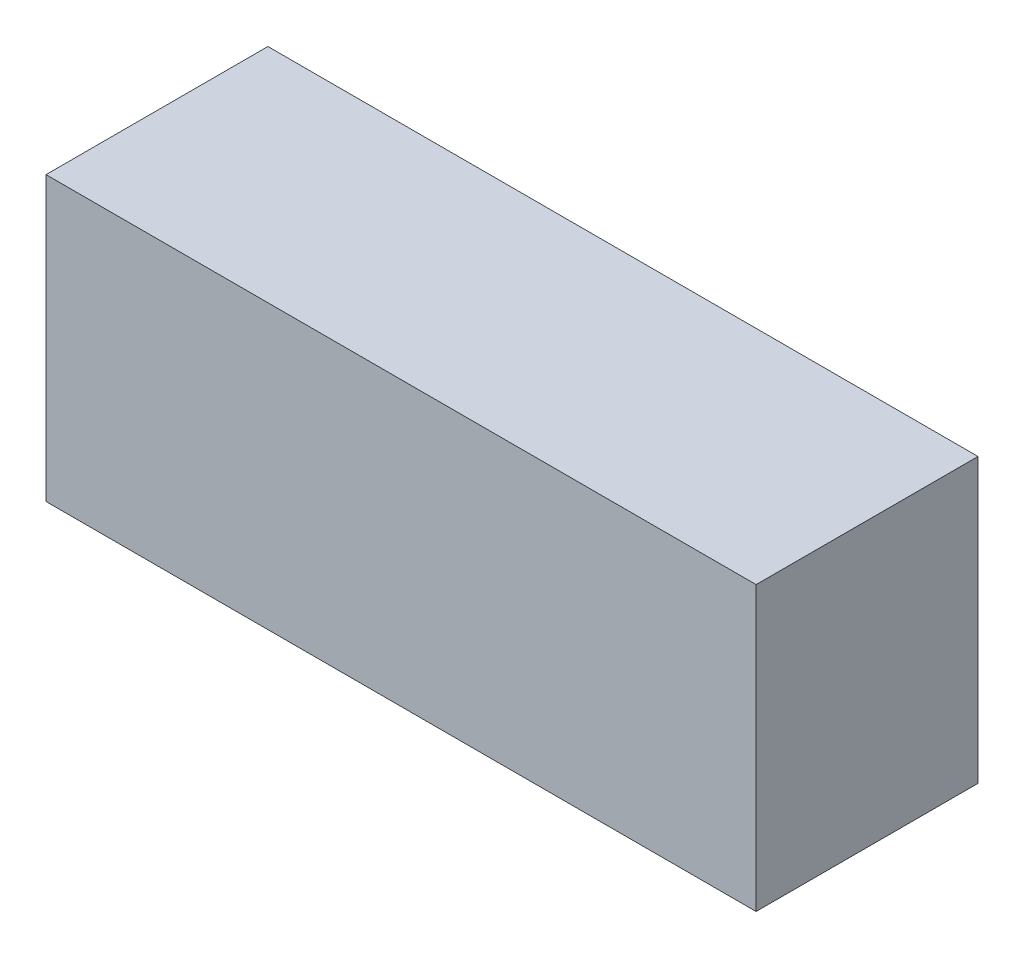
ISO-10303-21;
HEADER;
FILE_DESCRIPTION(('STEP AP214'),'2;1');
FILE_NAME('part.step','',(''),(''),'','','');
FILE_SCHEMA(('AUTOMOTIVE_DESIGN { 1 0 10303 214 1 1 1 1 }'));
ENDSEC;
DATA;
#1=APPLICATION_CONTEXT('core data for automotive mechanical design processes');
#2=APPLICATION_PROTOCOL_DEFINITION('international standard','automotive_design',2000,#1);
#3=PRODUCT_CONTEXT('',#1,'mechanical');
#4=PRODUCT('Part','Part','',(#3));
#5=PRODUCT_RELATED_PRODUCT_CATEGORY('part','',(#4));
#6=PRODUCT_DEFINITION_FORMATION('','',#4);
#7=PRODUCT_DEFINITION_CONTEXT('part definition',#1,'design');
#8=PRODUCT_DEFINITION('design','',#6,#7);
#9=PRODUCT_DEFINITION_SHAPE('','',#8);
#10=(LENGTH_UNIT() NAMED_UNIT(*) SI_UNIT(.MILLI.,.METRE.));
#11=(NAMED_UNIT(*) PLANE_ANGLE_UNIT() SI_UNIT($,.RADIAN.));
#12=(NAMED_UNIT(*) SI_UNIT($,.STERADIAN.) SOLID_ANGLE_UNIT());
#13=UNCERTAINTY_MEASURE_WITH_UNIT(LENGTH_MEASURE(1.E-05),#10,'distance_accuracy_value','');
#14=(GEOMETRIC_REPRESENTATION_CONTEXT(3) GLOBAL_UNCERTAINTY_ASSIGNED_CONTEXT((#13)) GLOBAL_UNIT_ASSIGNED_CONTEXT((#10,
#11,#12)) REPRESENTATION_CONTEXT('',''));
#15=CARTESIAN_POINT('',(0.,0.,0.));
#16=DIRECTION('',(0.,0.,1.));
#17=DIRECTION('',(1.,0.,0.));
#18=AXIS2_PLACEMENT_3D('',#15,#16,#17);
#19=CARTESIAN_POINT('',(9.398,3.175,1.6));
#20=DIRECTION('',(0.,0.,-1.));
#21=DIRECTION('',(0.,-1.,0.));
#22=AXIS2_PLACEMENT_3D('',#19,#20,#21);
#23=PLANE('',#22);
#24=DIRECTION('',(0.,-1.,0.));
#25=VECTOR('',#24,1.);
#26=CARTESIAN_POINT('',(7.798,2.55,1.6));
#27=LINE('',#26,#25);
#28=CARTESIAN_POINT('',(7.798,3.8258,1.6));
#29=VERTEX_POINT('',#28);
#30=CARTESIAN_POINT('',(7.798,2.55,1.6));
#31=VERTEX_POINT('',#30);
#32=EDGE_CURVE('E101',#29,#31,#27,.T.);
#33=ORIENTED_EDGE('',*,*,#32,.F.);
#34=DIRECTION('',(-1.,0.,0.));
#35=VECTOR('',#34,1.);
#36=CARTESIAN_POINT('',(7.798,3.8258,1.6));
#37=LINE('',#36,#35);
#38=CARTESIAN_POINT('',(10.998,3.8258,1.6));
#39=VERTEX_POINT('',#38);
#40=EDGE_CURVE('E26',#39,#29,#37,.T.);
#41=ORIENTED_EDGE('',*,*,#40,.F.);
#42=DIRECTION('',(0.,1.,0.));
#43=VECTOR('',#42,1.);
#44=CARTESIAN_POINT('',(10.998,3.8258,1.6));
#45=LINE('',#44,#43);
#46=CARTESIAN_POINT('',(10.998,2.55,1.6));
#47=VERTEX_POINT('',#46);
#48=EDGE_CURVE('E84',#47,#39,#45,.T.);
#49=ORIENTED_EDGE('',*,*,#48,.F.);
#50=DIRECTION('',(1.,0.,0.));
#51=VECTOR('',#50,1.);
#52=CARTESIAN_POINT('',(10.998,2.55,1.6));
#53=LINE('',#52,#51);
#54=EDGE_CURVE('E87',#31,#47,#53,.T.);
#55=ORIENTED_EDGE('',*,*,#54,.F.);
#56=EDGE_LOOP('',(#33,#41,#49,#55));
#57=FACE_BOUND('',#56,.T.);
#58=ADVANCED_FACE('F16',(#57),#23,.T.);
#59=CARTESIAN_POINT('',(9.398,3.175,2.6));
#60=DIRECTION('',(0.,0.,-1.));
#61=DIRECTION('',(0.,-1.,0.));
#62=AXIS2_PLACEMENT_3D('',#59,#60,#61);
#63=PLANE('',#62);
#64=DIRECTION('',(0.,-1.,0.));
#65=VECTOR('',#64,1.);
#66=CARTESIAN_POINT('',(7.798,2.55,2.6));
#67=LINE('',#66,#65);
#68=CARTESIAN_POINT('',(7.798,3.8258,2.6));
#69=VERTEX_POINT('',#68);
#70=CARTESIAN_POINT('',(7.798,2.55,2.6));
#71=VERTEX_POINT('',#70);
#72=EDGE_CURVE('E79',#69,#71,#67,.T.);
#73=ORIENTED_EDGE('',*,*,#72,.T.);
#74=DIRECTION('',(1.,0.,0.));
#75=VECTOR('',#74,1.);
#76=CARTESIAN_POINT('',(10.998,2.55,2.6));
#77=LINE('',#76,#75);
#78=CARTESIAN_POINT('',(10.998,2.55,2.6));
#79=VERTEX_POINT('',#78);
#80=EDGE_CURVE('E76',#71,#79,#77,.T.);
#81=ORIENTED_EDGE('',*,*,#80,.T.);
#82=DIRECTION('',(0.,1.,0.));
#83=VECTOR('',#82,1.);
#84=CARTESIAN_POINT('',(10.998,3.8258,2.6));
#85=LINE('',#84,#83);
#86=CARTESIAN_POINT('',(10.998,3.8258,2.6));
#87=VERTEX_POINT('',#86);
#88=EDGE_CURVE('E19',#79,#87,#85,.T.);
#89=ORIENTED_EDGE('',*,*,#88,.T.);
#90=DIRECTION('',(-1.,0.,0.));
#91=VECTOR('',#90,1.);
#92=CARTESIAN_POINT('',(7.798,3.8258,2.6));
#93=LINE('',#92,#91);
#94=EDGE_CURVE('E11',#87,#69,#93,.T.);
#95=ORIENTED_EDGE('',*,*,#94,.T.);
#96=EDGE_LOOP('',(#73,#81,#89,#95));
#97=FACE_BOUND('',#96,.T.);
#98=ADVANCED_FACE('F77',(#97),#63,.F.);
#99=CARTESIAN_POINT('',(7.798,3.8258,2.6));
#100=DIRECTION('',(0.,-1.,0.));
#101=DIRECTION('',(0.,0.,-1.));
#102=AXIS2_PLACEMENT_3D('',#99,#100,#101);
#103=PLANE('',#102);
#104=ORIENTED_EDGE('',*,*,#40,.T.);
#105=DIRECTION('',(0.,0.,-1.));
#106=VECTOR('',#105,1.);
#107=CARTESIAN_POINT('',(7.798,3.8258,2.6));
#108=LINE('',#107,#106);
#109=EDGE_CURVE('E93',#69,#29,#108,.T.);
#110=ORIENTED_EDGE('',*,*,#109,.F.);
#111=ORIENTED_EDGE('',*,*,#94,.F.);
#112=DIRECTION('',(0.,0.,-1.));
#113=VECTOR('',#112,1.);
#114=CARTESIAN_POINT('',(10.998,3.8258,2.6));
#115=LINE('',#114,#113);
#116=EDGE_CURVE('E71',#87,#39,#115,.T.);
#117=ORIENTED_EDGE('',*,*,#116,.T.);
#118=EDGE_LOOP('',(#104,#110,#111,#117));
#119=FACE_BOUND('',#118,.T.);
#120=ADVANCED_FACE('F118',(#119),#103,.F.);
#121=CARTESIAN_POINT('',(10.998,3.8258,2.6));
#122=DIRECTION('',(-1.,0.,0.));
#123=DIRECTION('',(0.,0.,1.));
#124=AXIS2_PLACEMENT_3D('',#121,#122,#123);
#125=PLANE('',#124);
#126=ORIENTED_EDGE('',*,*,#48,.T.);
#127=ORIENTED_EDGE('',*,*,#116,.F.);
#128=ORIENTED_EDGE('',*,*,#88,.F.);
#129=DIRECTION('',(0.,0.,-1.));
#130=VECTOR('',#129,1.);
#131=CARTESIAN_POINT('',(10.998,2.55,2.6));
#132=LINE('',#131,#130);
#133=EDGE_CURVE('E69',#79,#47,#132,.T.);
#134=ORIENTED_EDGE('',*,*,#133,.T.);
#135=EDGE_LOOP('',(#126,#127,#128,#134));
#136=FACE_BOUND('',#135,.T.);
#137=ADVANCED_FACE('F67',(#136),#125,.F.);
#138=CARTESIAN_POINT('',(10.998,2.55,2.6));
#139=DIRECTION('',(0.,1.,0.));
#140=DIRECTION('',(1.,0.,0.));
#141=AXIS2_PLACEMENT_3D('',#138,#139,#140);
#142=PLANE('',#141);
#143=ORIENTED_EDGE('',*,*,#54,.T.);
#144=ORIENTED_EDGE('',*,*,#133,.F.);
#145=ORIENTED_EDGE('',*,*,#80,.F.);
#146=DIRECTION('',(0.,0.,-1.));
#147=VECTOR('',#146,1.);
#148=CARTESIAN_POINT('',(7.798,2.55,2.6));
#149=LINE('',#148,#147);
#150=EDGE_CURVE('E96',#71,#31,#149,.T.);
#151=ORIENTED_EDGE('',*,*,#150,.T.);
#152=EDGE_LOOP('',(#143,#144,#145,#151));
#153=FACE_BOUND('',#152,.T.);
#154=ADVANCED_FACE('F86',(#153),#142,.F.);
#155=CARTESIAN_POINT('',(7.798,2.55,2.6));
#156=DIRECTION('',(1.,0.,0.));
#157=DIRECTION('',(0.,1.,0.));
#158=AXIS2_PLACEMENT_3D('',#155,#156,#157);
#159=PLANE('',#158);
#160=ORIENTED_EDGE('',*,*,#32,.T.);
#161=ORIENTED_EDGE('',*,*,#150,.F.);
#162=ORIENTED_EDGE('',*,*,#72,.F.);
#163=ORIENTED_EDGE('',*,*,#109,.T.);
#164=EDGE_LOOP('',(#160,#161,#162,#163));
#165=FACE_BOUND('',#164,.T.);
#166=ADVANCED_FACE('F116',(#165),#159,.F.);
#167=CLOSED_SHELL('',(#58,#98,#120,#137,#154,#166));
#168=MANIFOLD_SOLID_BREP('B1',#167);
#169=ADVANCED_BREP_SHAPE_REPRESENTATION('',(#18,#168),#14);
#170=SHAPE_DEFINITION_REPRESENTATION(#9,#169);
ENDSEC;
END-ISO-10303-21;
